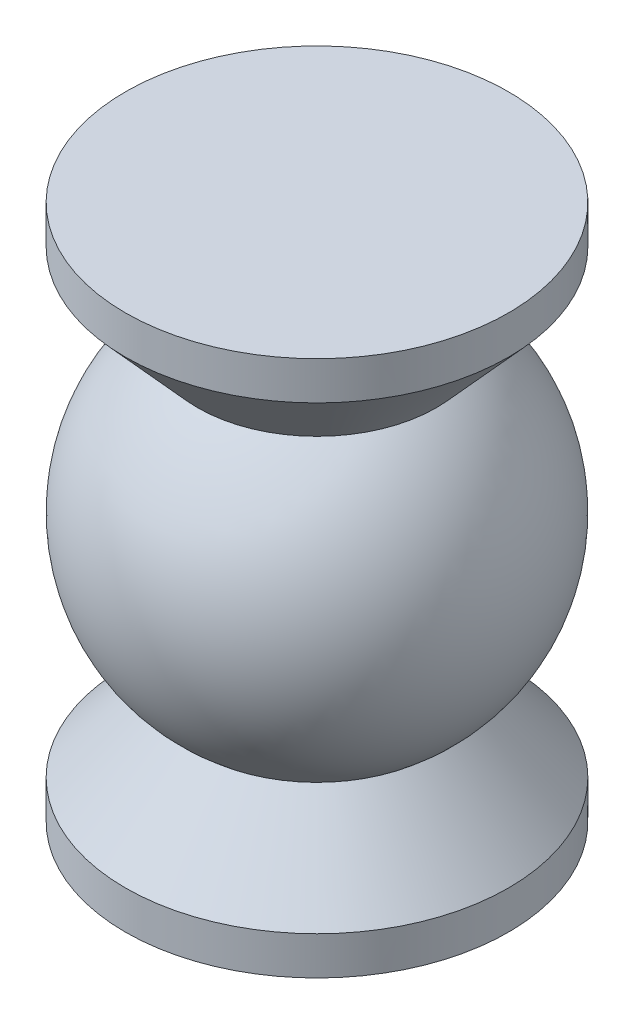
ISO-10303-21;
HEADER;
FILE_DESCRIPTION(('STEP AP214'),'2;1');
FILE_NAME('part.step','',(''),(''),'','','');
FILE_SCHEMA(('AUTOMOTIVE_DESIGN { 1 0 10303 214 1 1 1 1 }'));
ENDSEC;
DATA;
#1=APPLICATION_CONTEXT('core data for automotive mechanical design processes');
#2=APPLICATION_PROTOCOL_DEFINITION('international standard','automotive_design',2000,#1);
#3=PRODUCT_CONTEXT('',#1,'mechanical');
#4=PRODUCT('Part','Part','',(#3));
#5=PRODUCT_RELATED_PRODUCT_CATEGORY('part','',(#4));
#6=PRODUCT_DEFINITION_FORMATION('','',#4);
#7=PRODUCT_DEFINITION_CONTEXT('part definition',#1,'design');
#8=PRODUCT_DEFINITION('design','',#6,#7);
#9=PRODUCT_DEFINITION_SHAPE('','',#8);
#10=(LENGTH_UNIT() NAMED_UNIT(*) SI_UNIT(.MILLI.,.METRE.));
#11=(NAMED_UNIT(*) PLANE_ANGLE_UNIT() SI_UNIT($,.RADIAN.));
#12=(NAMED_UNIT(*) SI_UNIT($,.STERADIAN.) SOLID_ANGLE_UNIT());
#13=UNCERTAINTY_MEASURE_WITH_UNIT(LENGTH_MEASURE(1.E-05),#10,'distance_accuracy_value','');
#14=(GEOMETRIC_REPRESENTATION_CONTEXT(3) GLOBAL_UNCERTAINTY_ASSIGNED_CONTEXT((#13)) GLOBAL_UNIT_ASSIGNED_CONTEXT((#10,
#11,#12)) REPRESENTATION_CONTEXT('',''));
#15=CARTESIAN_POINT('',(0.,0.,0.));
#16=DIRECTION('',(0.,0.,1.));
#17=DIRECTION('',(1.,0.,0.));
#18=AXIS2_PLACEMENT_3D('',#15,#16,#17);
#19=CARTESIAN_POINT('',(0.,-5.,0.));
#20=DIRECTION('',(0.,1.,0.));
#21=DIRECTION('',(0.,0.,1.));
#22=AXIS2_PLACEMENT_3D('',#19,#20,#21);
#23=CYLINDRICAL_SURFACE('',#22,25.);
#24=CARTESIAN_POINT('',(0.,-5.,0.));
#25=DIRECTION('',(0.,1.,0.));
#26=DIRECTION('',(-1.,0.,0.));
#27=AXIS2_PLACEMENT_3D('',#24,#25,#26);
#28=CIRCLE('',#27,25.);
#29=CARTESIAN_POINT('',(-25.,-5.00000000000001,0.));
#30=VERTEX_POINT('',#29);
#31=EDGE_CURVE('E45',#30,#30,#28,.T.);
#32=ORIENTED_EDGE('',*,*,#31,.T.);
#33=EDGE_LOOP('',(#32));
#34=FACE_BOUND('',#33,.T.);
#35=CARTESIAN_POINT('',(0.,0.,0.));
#36=DIRECTION('',(0.,1.,0.));
#37=DIRECTION('',(0.,0.,1.));
#38=AXIS2_PLACEMENT_3D('',#35,#36,#37);
#39=CIRCLE('',#38,25.);
#40=CARTESIAN_POINT('',(0.,0.,25.));
#41=VERTEX_POINT('',#40);
#42=EDGE_CURVE('E10',#41,#41,#39,.T.);
#43=ORIENTED_EDGE('',*,*,#42,.F.);
#44=EDGE_LOOP('',(#43));
#45=FACE_BOUND('',#44,.T.);
#46=ADVANCED_FACE('F35',(#34,#45),#23,.T.);
#47=CARTESIAN_POINT('',(0.,0.,0.));
#48=DIRECTION('',(0.,1.,0.));
#49=DIRECTION('',(0.,0.,1.));
#50=AXIS2_PLACEMENT_3D('',#47,#48,#49);
#51=PLANE('',#50);
#52=ORIENTED_EDGE('',*,*,#42,.T.);
#53=EDGE_LOOP('',(#52));
#54=FACE_BOUND('',#53,.T.);
#55=ADVANCED_FACE('F76',(#54),#51,.T.);
#56=CARTESIAN_POINT('',(0.,-35.,0.));
#57=DIRECTION('',(0.,1.,0.));
#58=DIRECTION('',(1.,0.,0.));
#59=AXIS2_PLACEMENT_3D('',#56,#57,#58);
#60=SPHERICAL_SURFACE('',#59,25.);
#61=CARTESIAN_POINT('',(0.,-54.5572759307899,0.));
#62=DIRECTION('',(0.,1.,0.));
#63=DIRECTION('',(-1.,0.,0.));
#64=AXIS2_PLACEMENT_3D('',#61,#62,#63);
#65=CIRCLE('',#64,15.5728275585054);
#66=CARTESIAN_POINT('',(15.5728275585054,-54.5572759307899,0.));
#67=VERTEX_POINT('',#66);
#68=EDGE_CURVE('E49',#67,#67,#65,.T.);
#69=CARTESIAN_POINT('',(0.,-15.4427240692101,0.));
#70=DIRECTION('',(0.,1.,0.));
#71=DIRECTION('',(-1.,0.,0.));
#72=AXIS2_PLACEMENT_3D('',#69,#70,#71);
#73=CIRCLE('',#72,15.5728275585054);
#74=CARTESIAN_POINT('',(15.5728275585054,-15.4427240692101,0.));
#75=VERTEX_POINT('',#74);
#76=EDGE_CURVE('E41',#75,#75,#73,.T.);
#77=CARTESIAN_POINT('',(15.5728275585054,-54.5572759307899,0.));
#78=CARTESIAN_POINT('',(15.9388580961714,-54.2658366060626,0.));
#79=CARTESIAN_POINT('',(16.2966874540931,-53.964100075973,0.));
#80=CARTESIAN_POINT('',(16.9948595604488,-53.3410322435691,0.));
#81=CARTESIAN_POINT('',(17.3352023088828,-53.0197009412548,0.));
#82=CARTESIAN_POINT('',(17.9973169462639,-52.3584432029013,0.));
#83=CARTESIAN_POINT('',(18.3190888352111,-52.0185167668621,0.));
#84=CARTESIAN_POINT('',(18.9430507970489,-51.3211435497333,0.));
#85=CARTESIAN_POINT('',(19.2452408699397,-50.9636967686437,0.));
#86=CARTESIAN_POINT('',(19.829085999278,-50.2324084324473,0.));
#87=CARTESIAN_POINT('',(20.1107410557256,-49.8585668773405,0.));
#88=CARTESIAN_POINT('',(20.6526287289212,-49.0956674209473,0.));
#89=CARTESIAN_POINT('',(20.9128613456691,-48.7066095196608,0.));
#90=CARTESIAN_POINT('',(21.4110839458154,-47.9145034353497,0.));
#91=CARTESIAN_POINT('',(21.6490739292137,-47.5114552523251,0.));
#92=CARTESIAN_POINT('',(22.1020612436881,-46.692638845213,0.));
#93=CARTESIAN_POINT('',(22.3170585747641,-46.2768706211257,0.));
#94=CARTESIAN_POINT('',(22.7233830074992,-45.4339244374328,0.));
#95=CARTESIAN_POINT('',(22.9147101091581,-45.0067464778273,0.));
#96=CARTESIAN_POINT('',(23.2730911091146,-44.1423270930097,0.));
#97=CARTESIAN_POINT('',(23.440145007412,-43.7050856677976,0.));
#98=CARTESIAN_POINT('',(23.7494531232189,-42.8219173354561,0.));
#99=CARTESIAN_POINT('',(23.8917073407283,-42.3759904283268,0.));
#100=CARTESIAN_POINT('',(24.1509677751217,-41.4768564889277,0.));
#101=CARTESIAN_POINT('',(24.2679739920059,-41.0236494566579,0.));
#102=CARTESIAN_POINT('',(24.4763696753017,-40.1113835672455,0.));
#103=CARTESIAN_POINT('',(24.5677591417134,-39.6523247101029,0.));
#104=CARTESIAN_POINT('',(24.7246333064705,-38.7298019135069,0.));
#105=CARTESIAN_POINT('',(24.790118004816,-38.2663379740536,0.));
#106=CARTESIAN_POINT('',(24.8949762557637,-37.3364656381849,0.));
#107=CARTESIAN_POINT('',(24.9343498083659,-36.8700572417694,0.));
#108=CARTESIAN_POINT('',(24.9868616804841,-35.9357658969027,0.));
#109=CARTESIAN_POINT('',(25.,-35.4678829484513,0.));
#110=CARTESIAN_POINT('',(25.,-34.5321170515486,0.));
#111=CARTESIAN_POINT('',(24.9868616804841,-34.0642341030973,0.));
#112=CARTESIAN_POINT('',(24.9343498083659,-33.1299427582305,0.));
#113=CARTESIAN_POINT('',(24.8949762557637,-32.6635343618151,0.));
#114=CARTESIAN_POINT('',(24.790118004816,-31.7336620259464,0.));
#115=CARTESIAN_POINT('',(24.7246333064705,-31.2701980864931,0.));
#116=CARTESIAN_POINT('',(24.5677591417134,-30.3476752898971,0.));
#117=CARTESIAN_POINT('',(24.4763696753017,-29.8886164327545,0.));
#118=CARTESIAN_POINT('',(24.2679739920059,-28.9763505433421,0.));
#119=CARTESIAN_POINT('',(24.1509677751217,-28.5231435110723,0.));
#120=CARTESIAN_POINT('',(23.8917073407283,-27.6240095716732,0.));
#121=CARTESIAN_POINT('',(23.7494531232189,-27.1780826645438,0.));
#122=CARTESIAN_POINT('',(23.440145007412,-26.2949143322024,0.));
#123=CARTESIAN_POINT('',(23.2730911091146,-25.8576729069903,0.));
#124=CARTESIAN_POINT('',(22.9147101091581,-24.9932535221726,0.));
#125=CARTESIAN_POINT('',(22.7233830074992,-24.5660755625672,0.));
#126=CARTESIAN_POINT('',(22.3170585747641,-23.7231293788743,0.));
#127=CARTESIAN_POINT('',(22.1020612436881,-23.3073611547869,0.));
#128=CARTESIAN_POINT('',(21.6490739292137,-22.4885447476749,0.));
#129=CARTESIAN_POINT('',(21.4110839458154,-22.0854965646503,0.));
#130=CARTESIAN_POINT('',(20.9128613456691,-21.2933904803392,0.));
#131=CARTESIAN_POINT('',(20.6526287289212,-20.9043325790527,0.));
#132=CARTESIAN_POINT('',(20.1107410557256,-20.1414331226595,0.));
#133=CARTESIAN_POINT('',(19.829085999278,-19.7675915675527,0.));
#134=CARTESIAN_POINT('',(19.2452408699396,-19.0363032313563,0.));
#135=CARTESIAN_POINT('',(18.9430507970489,-18.6788564502667,0.));
#136=CARTESIAN_POINT('',(18.3190888352111,-17.9814832331379,0.));
#137=CARTESIAN_POINT('',(17.9973169462639,-17.6415567970987,0.));
#138=CARTESIAN_POINT('',(17.3352023088828,-16.9802990587452,0.));
#139=CARTESIAN_POINT('',(16.9948595604488,-16.6589677564309,0.));
#140=CARTESIAN_POINT('',(16.2966874540931,-16.035899924027,0.));
#141=CARTESIAN_POINT('',(15.9388580961714,-15.7341633939374,0.));
#142=CARTESIAN_POINT('',(15.5728275585054,-15.4427240692101,0.));
#143=B_SPLINE_CURVE_WITH_KNOTS('',3,(#77,#78,#79,#80,#81,#82,#83,#84,#85,#86,#87,#88,#89,#90,
#91,#92,#93,#94,#95,#96,#97,#98,#99,#100,#101,#102,#103,#104,#105,#106,#107,#108,#109,#110,#111,
#112,#113,#114,#115,#116,#117,#118,#119,#120,#121,#122,#123,#124,#125,#126,#127,#128,#129,#130,
#131,#132,#133,#134,#135,#136,#137,#138,#139,#140,#141,#142),.UNSPECIFIED.,.F.,.F.,(4,2,2,2,2,2,
2,2,2,2,2,2,2,2,2,2,2,2,2,2,2,2,2,2,2,2,2,2,2,2,2,2,4),(0.,1.40346456269808,2.80692912539616,
4.21039368809424,5.61385825079232,7.0173228134904,8.42078737618847,9.82425193888655,
11.2277165015846,12.6311810642827,14.0346456269808,15.4381101896789,16.8415747523769,
18.245039315075,19.6485038777731,21.0519684404712,22.4554330031693,23.8588975658673,
25.2623621285654,26.6658266912635,28.0692912539616,29.4727558166597,30.8762203793577,
32.2796849420558,33.6831495047539,35.086614067452,36.4900786301501,37.8935431928481,
39.2970077555462,40.7004723182443,42.1039368809424,43.5074014436405,44.9108660063385),.UNSPECIFIED.);
#144=EDGE_CURVE('BSEAM81',#67,#75,#143,.T.);
#145=ORIENTED_EDGE('',*,*,#68,.T.);
#146=ORIENTED_EDGE('',*,*,#76,.F.);
#147=ORIENTED_EDGE('',*,*,#144,.T.);
#148=ORIENTED_EDGE('',*,*,#144,.F.);
#149=EDGE_LOOP('',(#145,#147,#146,#148));
#150=FACE_BOUND('',#149,.T.);
#151=ADVANCED_FACE('F81',(#150),#60,.T.);
#152=CARTESIAN_POINT('',(0.,-15.4427240692101,0.));
#153=DIRECTION('',(0.,1.,0.));
#154=DIRECTION('',(-1.,0.,0.));
#155=AXIS2_PLACEMENT_3D('',#152,#153,#154);
#156=CONICAL_SURFACE('',#155,15.5728275585054,0.734332536410905);
#157=ORIENTED_EDGE('',*,*,#31,.F.);
#158=EDGE_LOOP('',(#157));
#159=FACE_BOUND('',#158,.T.);
#160=ORIENTED_EDGE('',*,*,#76,.T.);
#161=EDGE_LOOP('',(#160));
#162=FACE_BOUND('',#161,.T.);
#163=ADVANCED_FACE('F85',(#159,#162),#156,.T.);
#164=CARTESIAN_POINT('',(0.,-54.5572759307899,0.));
#165=DIRECTION('',(0.,-1.,0.));
#166=DIRECTION('',(1.,0.,0.));
#167=AXIS2_PLACEMENT_3D('',#164,#165,#166);
#168=CONICAL_SURFACE('',#167,15.5728275585054,0.734332536410905);
#169=CARTESIAN_POINT('',(0.,-65.,0.));
#170=DIRECTION('',(0.,1.,0.));
#171=DIRECTION('',(0.,0.,1.));
#172=AXIS2_PLACEMENT_3D('',#169,#170,#171);
#173=CIRCLE('',#172,25.);
#174=CARTESIAN_POINT('',(0.,-65.,25.));
#175=VERTEX_POINT('',#174);
#176=EDGE_CURVE('E54',#175,#175,#173,.T.);
#177=ORIENTED_EDGE('',*,*,#176,.T.);
#178=EDGE_LOOP('',(#177));
#179=FACE_BOUND('',#178,.T.);
#180=ORIENTED_EDGE('',*,*,#68,.F.);
#181=EDGE_LOOP('',(#180));
#182=FACE_BOUND('',#181,.T.);
#183=ADVANCED_FACE('F61',(#179,#182),#168,.T.);
#184=CARTESIAN_POINT('',(0.,-65.,0.));
#185=DIRECTION('',(0.,-1.,0.));
#186=DIRECTION('',(0.,0.,-1.));
#187=AXIS2_PLACEMENT_3D('',#184,#185,#186);
#188=CYLINDRICAL_SURFACE('',#187,25.);
#189=ORIENTED_EDGE('',*,*,#176,.F.);
#190=EDGE_LOOP('',(#189));
#191=FACE_BOUND('',#190,.T.);
#192=CARTESIAN_POINT('',(0.,-70.,0.));
#193=DIRECTION('',(0.,1.,0.));
#194=DIRECTION('',(0.,0.,1.));
#195=AXIS2_PLACEMENT_3D('',#192,#193,#194);
#196=CIRCLE('',#195,25.);
#197=CARTESIAN_POINT('',(0.,-70.,25.));
#198=VERTEX_POINT('',#197);
#199=EDGE_CURVE('E55',#198,#198,#196,.T.);
#200=ORIENTED_EDGE('',*,*,#199,.T.);
#201=EDGE_LOOP('',(#200));
#202=FACE_BOUND('',#201,.T.);
#203=ADVANCED_FACE('F64',(#191,#202),#188,.T.);
#204=CARTESIAN_POINT('',(0.,-70.,0.));
#205=DIRECTION('',(0.,-1.,0.));
#206=DIRECTION('',(0.,0.,1.));
#207=AXIS2_PLACEMENT_3D('',#204,#205,#206);
#208=PLANE('',#207);
#209=ORIENTED_EDGE('',*,*,#199,.F.);
#210=EDGE_LOOP('',(#209));
#211=FACE_BOUND('',#210,.T.);
#212=ADVANCED_FACE('F67',(#211),#208,.T.);
#213=CLOSED_SHELL('',(#46,#55,#151,#163,#183,#203,#212));
#214=MANIFOLD_SOLID_BREP('B2',#213);
#215=ADVANCED_BREP_SHAPE_REPRESENTATION('',(#18,#214),#14);
#216=SHAPE_DEFINITION_REPRESENTATION(#9,#215);
ENDSEC;
END-ISO-10303-21;
